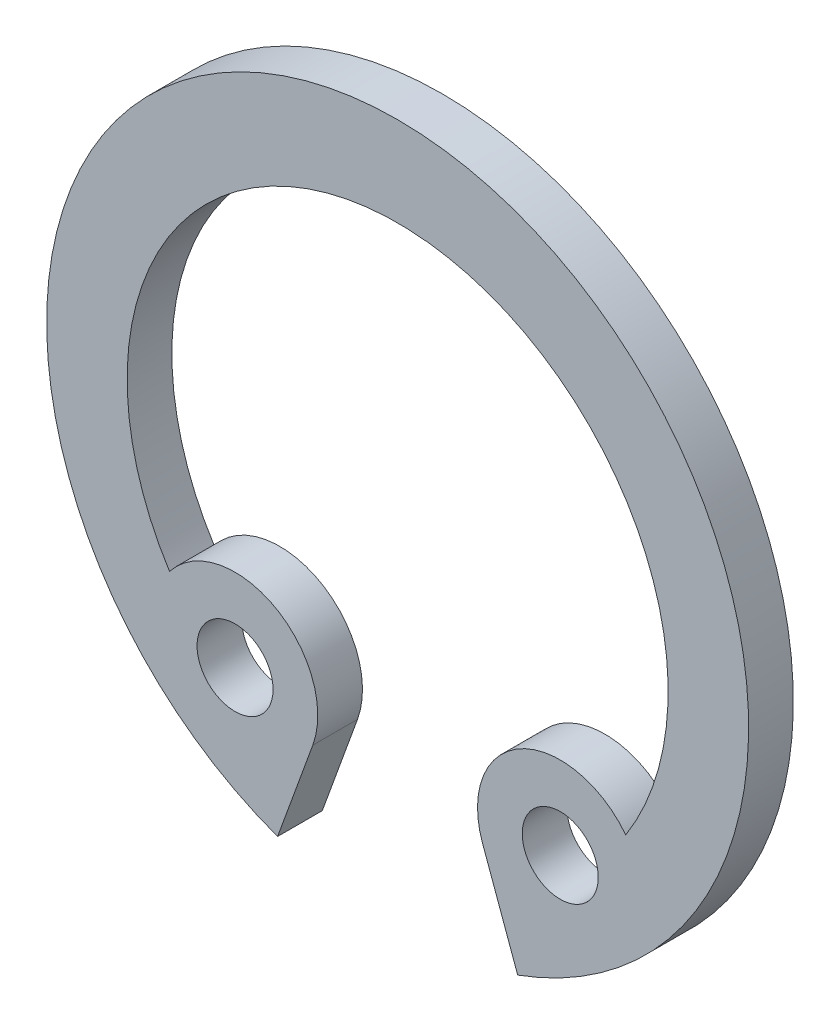
ISO-10303-21;
HEADER;
FILE_DESCRIPTION(('STEP AP214'),'2;1');
FILE_NAME('part.step','',(''),(''),'','','');
FILE_SCHEMA(('AUTOMOTIVE_DESIGN { 1 0 10303 214 1 1 1 1 }'));
ENDSEC;
DATA;
#1=APPLICATION_CONTEXT('core data for automotive mechanical design processes');
#2=APPLICATION_PROTOCOL_DEFINITION('international standard','automotive_design',2000,#1);
#3=PRODUCT_CONTEXT('',#1,'mechanical');
#4=PRODUCT('Part','Part','',(#3));
#5=PRODUCT_RELATED_PRODUCT_CATEGORY('part','',(#4));
#6=PRODUCT_DEFINITION_FORMATION('','',#4);
#7=PRODUCT_DEFINITION_CONTEXT('part definition',#1,'design');
#8=PRODUCT_DEFINITION('design','',#6,#7);
#9=PRODUCT_DEFINITION_SHAPE('','',#8);
#10=(LENGTH_UNIT() NAMED_UNIT(*) SI_UNIT(.MILLI.,.METRE.));
#11=(NAMED_UNIT(*) PLANE_ANGLE_UNIT() SI_UNIT($,.RADIAN.));
#12=(NAMED_UNIT(*) SI_UNIT($,.STERADIAN.) SOLID_ANGLE_UNIT());
#13=UNCERTAINTY_MEASURE_WITH_UNIT(LENGTH_MEASURE(1.E-05),#10,'distance_accuracy_value','');
#14=(GEOMETRIC_REPRESENTATION_CONTEXT(3) GLOBAL_UNCERTAINTY_ASSIGNED_CONTEXT((#13)) GLOBAL_UNIT_ASSIGNED_CONTEXT((#10,
#11,#12)) REPRESENTATION_CONTEXT('',''));
#15=CARTESIAN_POINT('',(0.,0.,0.));
#16=DIRECTION('',(0.,0.,1.));
#17=DIRECTION('',(1.,0.,0.));
#18=AXIS2_PLACEMENT_3D('',#15,#16,#17);
#19=CARTESIAN_POINT('',(0.,0.,0.));
#20=DIRECTION('',(0.,0.,1.));
#21=DIRECTION('',(1.,0.,0.));
#22=AXIS2_PLACEMENT_3D('',#19,#20,#21);
#23=PLANE('',#22);
#24=DIRECTION('',(0.342020143325699,0.939692620785897,0.));
#25=VECTOR('',#24,1.);
#26=CARTESIAN_POINT('',(-2.684858125106,-7.376587073169,0.));
#27=LINE('',#26,#25);
#28=CARTESIAN_POINT('',(-2.68485812510616,-7.37658707316945,0.));
#29=VERTEX_POINT('',#28);
#30=CARTESIAN_POINT('',(-1.89813476233069,-5.21508239858554,0.));
#31=VERTEX_POINT('',#30);
#32=EDGE_CURVE('E98',#29,#31,#27,.T.);
#33=ORIENTED_EDGE('',*,*,#32,.F.);
#34=CARTESIAN_POINT('',(0.,0.,0.));
#35=DIRECTION('',(0.,0.,1.));
#36=DIRECTION('',(1.,0.,0.));
#37=AXIS2_PLACEMENT_3D('',#34,#35,#36);
#38=CIRCLE('',#37,7.85);
#39=CARTESIAN_POINT('',(2.68485812510678,-7.37658707316928,0.));
#40=VERTEX_POINT('',#39);
#41=EDGE_CURVE('E117',#40,#29,#38,.T.);
#42=ORIENTED_EDGE('',*,*,#41,.F.);
#43=DIRECTION('',(0.342020143325699,-0.939692620785897,0.));
#44=VECTOR('',#43,1.);
#45=CARTESIAN_POINT('',(1.898134762331,-5.215082398585,0.));
#46=LINE('',#45,#44);
#47=CARTESIAN_POINT('',(1.89813476233105,-5.21508239858514,0.));
#48=VERTEX_POINT('',#47);
#49=EDGE_CURVE('E86',#48,#40,#46,.T.);
#50=ORIENTED_EDGE('',*,*,#49,.F.);
#51=CARTESIAN_POINT('',(3.636566110784,-4.582345133433,0.));
#52=DIRECTION('',(0.,0.,1.));
#53=DIRECTION('',(1.,0.,0.));
#54=AXIS2_PLACEMENT_3D('',#51,#52,#53);
#55=CIRCLE('',#54,1.85);
#56=CARTESIAN_POINT('',(5.10140381205461,-3.45241128185751,0.));
#57=VERTEX_POINT('',#56);
#58=EDGE_CURVE('E82',#57,#48,#55,.T.);
#59=ORIENTED_EDGE('',*,*,#58,.F.);
#60=CARTESIAN_POINT('',(0.,-0.2,0.));
#61=DIRECTION('',(0.,0.,1.));
#62=DIRECTION('',(1.,0.,0.));
#63=AXIS2_PLACEMENT_3D('',#60,#61,#62);
#64=CIRCLE('',#63,6.05);
#65=CARTESIAN_POINT('',(-5.10140381205511,-3.45241128185686,0.));
#66=VERTEX_POINT('',#65);
#67=EDGE_CURVE('E68',#57,#66,#64,.T.);
#68=ORIENTED_EDGE('',*,*,#67,.T.);
#69=CARTESIAN_POINT('',(-3.636566110785,-4.582345133433,0.));
#70=DIRECTION('',(0.,0.,1.));
#71=DIRECTION('',(1.,0.,0.));
#72=AXIS2_PLACEMENT_3D('',#69,#70,#71);
#73=CIRCLE('',#72,1.85);
#74=EDGE_CURVE('E115',#31,#66,#73,.T.);
#75=ORIENTED_EDGE('',*,*,#74,.F.);
#76=EDGE_LOOP('',(#33,#42,#50,#59,#68,#75));
#77=FACE_BOUND('',#76,.T.);
#78=CARTESIAN_POINT('',(-3.636566110784,-4.582345133433,0.));
#79=DIRECTION('',(0.,0.,1.));
#80=DIRECTION('',(1.,0.,0.));
#81=AXIS2_PLACEMENT_3D('',#78,#79,#80);
#82=CIRCLE('',#81,0.85);
#83=CARTESIAN_POINT('',(-2.786566110784,-4.582345133433,0.));
#84=VERTEX_POINT('',#83);
#85=EDGE_CURVE('E79',#84,#84,#82,.T.);
#86=ORIENTED_EDGE('',*,*,#85,.T.);
#87=EDGE_LOOP('',(#86));
#88=FACE_BOUND('',#87,.T.);
#89=CARTESIAN_POINT('',(3.636566110784,-4.582345133433,0.));
#90=DIRECTION('',(0.,0.,1.));
#91=DIRECTION('',(1.,0.,0.));
#92=AXIS2_PLACEMENT_3D('',#89,#90,#91);
#93=CIRCLE('',#92,0.85);
#94=CARTESIAN_POINT('',(4.486566110784,-4.582345133433,0.));
#95=VERTEX_POINT('',#94);
#96=EDGE_CURVE('E20',#95,#95,#93,.T.);
#97=ORIENTED_EDGE('',*,*,#96,.T.);
#98=EDGE_LOOP('',(#97));
#99=FACE_BOUND('',#98,.T.);
#100=ADVANCED_FACE('F17',(#77,#88,#99),#23,.F.);
#101=CARTESIAN_POINT('',(3.636566110784,-4.582345133433,-0.1));
#102=DIRECTION('',(0.,0.,1.));
#103=DIRECTION('',(1.,0.,0.));
#104=AXIS2_PLACEMENT_3D('',#101,#102,#103);
#105=CYLINDRICAL_SURFACE('',#104,0.85);
#106=ORIENTED_EDGE('',*,*,#96,.F.);
#107=EDGE_LOOP('',(#106));
#108=FACE_BOUND('',#107,.T.);
#109=CARTESIAN_POINT('',(3.636566110784,-4.582345133433,1.));
#110=DIRECTION('',(0.,0.,1.));
#111=DIRECTION('',(1.,0.,0.));
#112=AXIS2_PLACEMENT_3D('',#109,#110,#111);
#113=CIRCLE('',#112,0.85);
#114=CARTESIAN_POINT('',(4.486566110784,-4.582345133433,1.));
#115=VERTEX_POINT('',#114);
#116=EDGE_CURVE('E112',#115,#115,#113,.F.);
#117=ORIENTED_EDGE('',*,*,#116,.F.);
#118=EDGE_LOOP('',(#117));
#119=FACE_BOUND('',#118,.T.);
#120=ADVANCED_FACE('F124',(#108,#119),#105,.F.);
#121=CARTESIAN_POINT('',(-3.636566110784,-4.582345133433,-0.1));
#122=DIRECTION('',(0.,0.,1.));
#123=DIRECTION('',(1.,0.,0.));
#124=AXIS2_PLACEMENT_3D('',#121,#122,#123);
#125=CYLINDRICAL_SURFACE('',#124,0.85);
#126=ORIENTED_EDGE('',*,*,#85,.F.);
#127=EDGE_LOOP('',(#126));
#128=FACE_BOUND('',#127,.T.);
#129=CARTESIAN_POINT('',(-3.636566110784,-4.582345133433,1.));
#130=DIRECTION('',(0.,0.,1.));
#131=DIRECTION('',(1.,0.,0.));
#132=AXIS2_PLACEMENT_3D('',#129,#130,#131);
#133=CIRCLE('',#132,0.85);
#134=CARTESIAN_POINT('',(-2.786566110784,-4.582345133433,1.));
#135=VERTEX_POINT('',#134);
#136=EDGE_CURVE('E109',#135,#135,#133,.F.);
#137=ORIENTED_EDGE('',*,*,#136,.F.);
#138=EDGE_LOOP('',(#137));
#139=FACE_BOUND('',#138,.T.);
#140=ADVANCED_FACE('F127',(#128,#139),#125,.F.);
#141=CARTESIAN_POINT('',(0.,-0.2,0.));
#142=DIRECTION('',(0.,0.,1.));
#143=DIRECTION('',(1.,0.,0.));
#144=AXIS2_PLACEMENT_3D('',#141,#142,#143);
#145=CYLINDRICAL_SURFACE('',#144,6.05);
#146=ORIENTED_EDGE('',*,*,#67,.F.);
#147=DIRECTION('',(0.,0.,1.));
#148=VECTOR('',#147,1.);
#149=CARTESIAN_POINT('',(5.10140381205458,-3.45241128185747,0.));
#150=LINE('',#149,#148);
#151=CARTESIAN_POINT('',(5.10140381205462,-3.45241128185751,1.));
#152=VERTEX_POINT('',#151);
#153=EDGE_CURVE('E73',#152,#57,#150,.F.);
#154=ORIENTED_EDGE('',*,*,#153,.F.);
#155=CARTESIAN_POINT('',(0.,-0.2,1.));
#156=DIRECTION('',(0.,0.,1.));
#157=DIRECTION('',(1.,0.,0.));
#158=AXIS2_PLACEMENT_3D('',#155,#156,#157);
#159=CIRCLE('',#158,6.05);
#160=CARTESIAN_POINT('',(-5.10140381205511,-3.45241128185686,1.));
#161=VERTEX_POINT('',#160);
#162=EDGE_CURVE('E107',#161,#152,#159,.F.);
#163=ORIENTED_EDGE('',*,*,#162,.F.);
#164=DIRECTION('',(0.,0.,1.));
#165=VECTOR('',#164,1.);
#166=CARTESIAN_POINT('',(-5.10140381205512,-3.45241128185687,0.));
#167=LINE('',#166,#165);
#168=EDGE_CURVE('E76',#66,#161,#167,.T.);
#169=ORIENTED_EDGE('',*,*,#168,.F.);
#170=EDGE_LOOP('',(#146,#154,#163,#169));
#171=FACE_BOUND('',#170,.T.);
#172=ADVANCED_FACE('F70',(#171),#145,.F.);
#173=CARTESIAN_POINT('',(3.636566110784,-4.582345133433,0.));
#174=DIRECTION('',(0.,0.,1.));
#175=DIRECTION('',(1.,0.,0.));
#176=AXIS2_PLACEMENT_3D('',#173,#174,#175);
#177=CYLINDRICAL_SURFACE('',#176,1.85);
#178=DIRECTION('',(0.,0.,1.));
#179=VECTOR('',#178,1.);
#180=CARTESIAN_POINT('',(1.89813476233103,-5.21508239858509,0.));
#181=LINE('',#180,#179);
#182=CARTESIAN_POINT('',(1.89813476233099,-5.21508239858498,1.));
#183=VERTEX_POINT('',#182);
#184=EDGE_CURVE('E89',#183,#48,#181,.F.);
#185=ORIENTED_EDGE('',*,*,#184,.F.);
#186=CARTESIAN_POINT('',(3.636566110784,-4.582345133433,1.));
#187=DIRECTION('',(0.,0.,1.));
#188=DIRECTION('',(1.,0.,0.));
#189=AXIS2_PLACEMENT_3D('',#186,#187,#188);
#190=CIRCLE('',#189,1.85);
#191=EDGE_CURVE('E93',#152,#183,#190,.T.);
#192=ORIENTED_EDGE('',*,*,#191,.F.);
#193=ORIENTED_EDGE('',*,*,#153,.T.);
#194=ORIENTED_EDGE('',*,*,#58,.T.);
#195=EDGE_LOOP('',(#185,#192,#193,#194));
#196=FACE_BOUND('',#195,.T.);
#197=ADVANCED_FACE('F91',(#196),#177,.T.);
#198=CARTESIAN_POINT('',(1.898134762331,-5.215082398585,0.));
#199=DIRECTION('',(-0.939692620785897,-0.342020143325699,0.));
#200=DIRECTION('',(0.342020143325699,-0.939692620785897,0.));
#201=AXIS2_PLACEMENT_3D('',#198,#199,#200);
#202=PLANE('',#201);
#203=DIRECTION('',(0.,0.,1.));
#204=VECTOR('',#203,1.);
#205=CARTESIAN_POINT('',(2.68485812510658,-7.37658707316935,0.));
#206=LINE('',#205,#204);
#207=CARTESIAN_POINT('',(2.68485812510658,-7.37658707316935,1.));
#208=VERTEX_POINT('',#207);
#209=EDGE_CURVE('E101',#208,#40,#206,.F.);
#210=ORIENTED_EDGE('',*,*,#209,.F.);
#211=DIRECTION('',(0.342020143325525,-0.939692620785961,0.));
#212=VECTOR('',#211,1.);
#213=CARTESIAN_POINT('',(1.89813476233103,-5.21508239858509,1.));
#214=LINE('',#213,#212);
#215=EDGE_CURVE('E105',#183,#208,#214,.T.);
#216=ORIENTED_EDGE('',*,*,#215,.F.);
#217=ORIENTED_EDGE('',*,*,#184,.T.);
#218=ORIENTED_EDGE('',*,*,#49,.T.);
#219=EDGE_LOOP('',(#210,#216,#217,#218));
#220=FACE_BOUND('',#219,.T.);
#221=ADVANCED_FACE('F149',(#220),#202,.T.);
#222=CARTESIAN_POINT('',(0.,0.,0.));
#223=DIRECTION('',(0.,0.,1.));
#224=DIRECTION('',(1.,0.,0.));
#225=AXIS2_PLACEMENT_3D('',#222,#223,#224);
#226=CYLINDRICAL_SURFACE('',#225,7.85);
#227=DIRECTION('',(0.,0.,1.));
#228=VECTOR('',#227,1.);
#229=CARTESIAN_POINT('',(-2.68485812510615,-7.37658707316941,0.));
#230=LINE('',#229,#228);
#231=CARTESIAN_POINT('',(-2.68485812510617,-7.37658707316945,1.));
#232=VERTEX_POINT('',#231);
#233=EDGE_CURVE('E100',#232,#29,#230,.F.);
#234=ORIENTED_EDGE('',*,*,#233,.F.);
#235=CARTESIAN_POINT('',(0.,0.,1.));
#236=DIRECTION('',(0.,0.,1.));
#237=DIRECTION('',(1.,0.,0.));
#238=AXIS2_PLACEMENT_3D('',#235,#236,#237);
#239=CIRCLE('',#238,7.85);
#240=EDGE_CURVE('E103',#208,#232,#239,.T.);
#241=ORIENTED_EDGE('',*,*,#240,.F.);
#242=ORIENTED_EDGE('',*,*,#209,.T.);
#243=ORIENTED_EDGE('',*,*,#41,.T.);
#244=EDGE_LOOP('',(#234,#241,#242,#243));
#245=FACE_BOUND('',#244,.T.);
#246=ADVANCED_FACE('F146',(#245),#226,.T.);
#247=CARTESIAN_POINT('',(-2.684858125106,-7.376587073169,0.));
#248=DIRECTION('',(0.939692620785897,-0.342020143325699,0.));
#249=DIRECTION('',(0.342020143325699,0.939692620785897,0.));
#250=AXIS2_PLACEMENT_3D('',#247,#248,#249);
#251=PLANE('',#250);
#252=DIRECTION('',(0.,0.,1.));
#253=VECTOR('',#252,1.);
#254=CARTESIAN_POINT('',(-1.898134762331,-5.21508239858529,0.));
#255=LINE('',#254,#253);
#256=CARTESIAN_POINT('',(-1.89813476233082,-5.21508239858534,1.));
#257=VERTEX_POINT('',#256);
#258=EDGE_CURVE('E35',#257,#31,#255,.F.);
#259=ORIENTED_EDGE('',*,*,#258,.F.);
#260=DIRECTION('',(0.342020143325545,0.939692620785953,0.));
#261=VECTOR('',#260,1.);
#262=CARTESIAN_POINT('',(-2.68485812510615,-7.37658707316941,1.));
#263=LINE('',#262,#261);
#264=EDGE_CURVE('E26',#232,#257,#263,.T.);
#265=ORIENTED_EDGE('',*,*,#264,.F.);
#266=ORIENTED_EDGE('',*,*,#233,.T.);
#267=ORIENTED_EDGE('',*,*,#32,.T.);
#268=EDGE_LOOP('',(#259,#265,#266,#267));
#269=FACE_BOUND('',#268,.T.);
#270=ADVANCED_FACE('F139',(#269),#251,.T.);
#271=CARTESIAN_POINT('',(-3.636566110785,-4.582345133433,0.));
#272=DIRECTION('',(0.,0.,1.));
#273=DIRECTION('',(1.,0.,0.));
#274=AXIS2_PLACEMENT_3D('',#271,#272,#273);
#275=CYLINDRICAL_SURFACE('',#274,1.85);
#276=ORIENTED_EDGE('',*,*,#168,.T.);
#277=CARTESIAN_POINT('',(-3.636566110785,-4.582345133433,1.));
#278=DIRECTION('',(0.,0.,1.));
#279=DIRECTION('',(1.,0.,0.));
#280=AXIS2_PLACEMENT_3D('',#277,#278,#279);
#281=CIRCLE('',#280,1.85);
#282=EDGE_CURVE('E11',#257,#161,#281,.T.);
#283=ORIENTED_EDGE('',*,*,#282,.F.);
#284=ORIENTED_EDGE('',*,*,#258,.T.);
#285=ORIENTED_EDGE('',*,*,#74,.T.);
#286=EDGE_LOOP('',(#276,#283,#284,#285));
#287=FACE_BOUND('',#286,.T.);
#288=ADVANCED_FACE('F132',(#287),#275,.T.);
#289=CARTESIAN_POINT('',(0.,0.,1.));
#290=DIRECTION('',(0.,0.,1.));
#291=DIRECTION('',(1.,0.,0.));
#292=AXIS2_PLACEMENT_3D('',#289,#290,#291);
#293=PLANE('',#292);
#294=ORIENTED_EDGE('',*,*,#282,.T.);
#295=ORIENTED_EDGE('',*,*,#162,.T.);
#296=ORIENTED_EDGE('',*,*,#191,.T.);
#297=ORIENTED_EDGE('',*,*,#215,.T.);
#298=ORIENTED_EDGE('',*,*,#240,.T.);
#299=ORIENTED_EDGE('',*,*,#264,.T.);
#300=EDGE_LOOP('',(#294,#295,#296,#297,#298,#299));
#301=FACE_BOUND('',#300,.T.);
#302=ORIENTED_EDGE('',*,*,#136,.T.);
#303=EDGE_LOOP('',(#302));
#304=FACE_BOUND('',#303,.T.);
#305=ORIENTED_EDGE('',*,*,#116,.T.);
#306=EDGE_LOOP('',(#305));
#307=FACE_BOUND('',#306,.T.);
#308=ADVANCED_FACE('F130',(#301,#304,#307),#293,.T.);
#309=CLOSED_SHELL('',(#100,#120,#140,#172,#197,#221,#246,#270,#288,#308));
#310=MANIFOLD_SOLID_BREP('B1',#309);
#311=ADVANCED_BREP_SHAPE_REPRESENTATION('',(#18,#310),#14);
#312=SHAPE_DEFINITION_REPRESENTATION(#9,#311);
ENDSEC;
END-ISO-10303-21;
